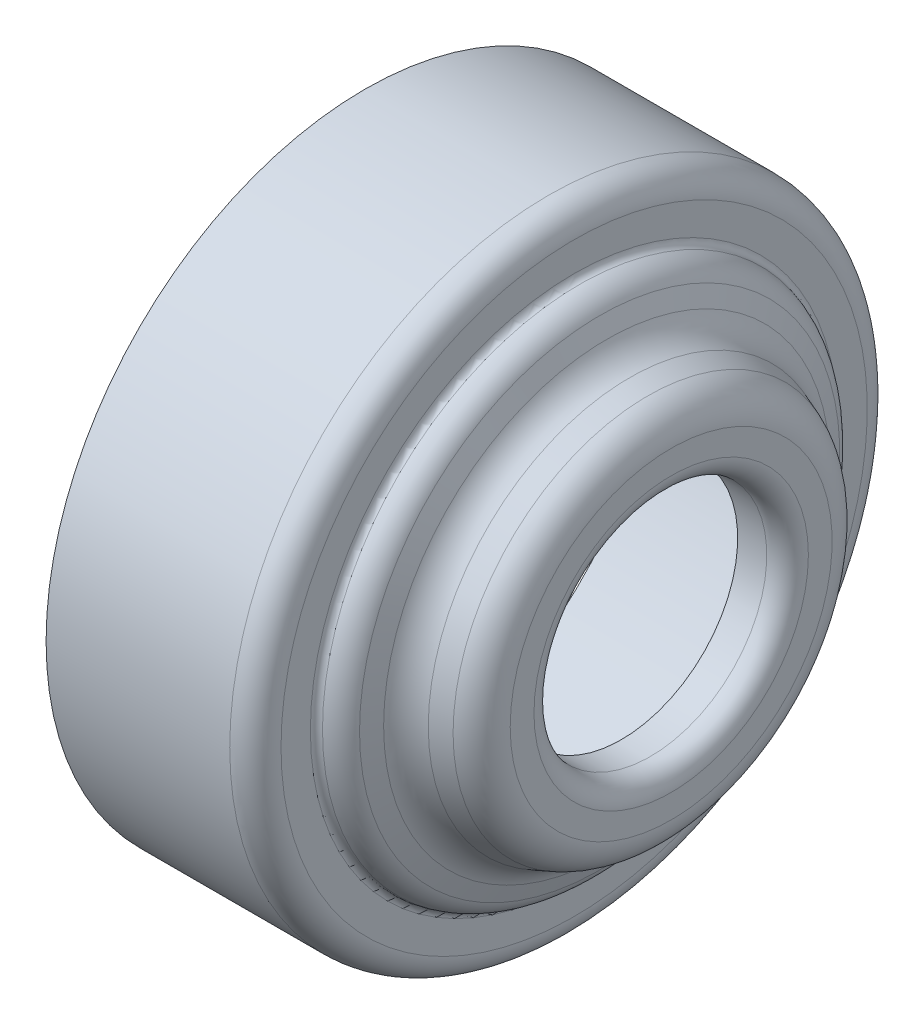
ISO-10303-21;
HEADER;
FILE_DESCRIPTION(('STEP AP214'),'2;1');
FILE_NAME('part.step','',(''),(''),'','','');
FILE_SCHEMA(('AUTOMOTIVE_DESIGN { 1 0 10303 214 1 1 1 1 }'));
ENDSEC;
DATA;
#1=APPLICATION_CONTEXT('core data for automotive mechanical design processes');
#2=APPLICATION_PROTOCOL_DEFINITION('international standard','automotive_design',2000,#1);
#3=PRODUCT_CONTEXT('',#1,'mechanical');
#4=PRODUCT('Part','Part','',(#3));
#5=PRODUCT_RELATED_PRODUCT_CATEGORY('part','',(#4));
#6=PRODUCT_DEFINITION_FORMATION('','',#4);
#7=PRODUCT_DEFINITION_CONTEXT('part definition',#1,'design');
#8=PRODUCT_DEFINITION('design','',#6,#7);
#9=PRODUCT_DEFINITION_SHAPE('','',#8);
#10=(LENGTH_UNIT() NAMED_UNIT(*) SI_UNIT(.MILLI.,.METRE.));
#11=(NAMED_UNIT(*) PLANE_ANGLE_UNIT() SI_UNIT($,.RADIAN.));
#12=(NAMED_UNIT(*) SI_UNIT($,.STERADIAN.) SOLID_ANGLE_UNIT());
#13=UNCERTAINTY_MEASURE_WITH_UNIT(LENGTH_MEASURE(1.E-05),#10,'distance_accuracy_value','');
#14=(GEOMETRIC_REPRESENTATION_CONTEXT(3) GLOBAL_UNCERTAINTY_ASSIGNED_CONTEXT((#13)) GLOBAL_UNIT_ASSIGNED_CONTEXT((#10,
#11,#12)) REPRESENTATION_CONTEXT('',''));
#15=CARTESIAN_POINT('',(0.,0.,0.));
#16=DIRECTION('',(0.,0.,1.));
#17=DIRECTION('',(1.,0.,0.));
#18=AXIS2_PLACEMENT_3D('',#15,#16,#17);
#19=CARTESIAN_POINT('',(-14.5,23.,0.));
#20=DIRECTION('',(1.,0.,0.));
#21=DIRECTION('',(0.,0.,-1.));
#22=AXIS2_PLACEMENT_3D('',#19,#20,#21);
#23=PLANE('',#22);
#24=CARTESIAN_POINT('',(-14.5,0.,0.));
#25=DIRECTION('',(-1.,0.,0.));
#26=DIRECTION('',(0.,0.,1.));
#27=AXIS2_PLACEMENT_3D('',#24,#25,#26);
#28=CIRCLE('',#27,22.);
#29=CARTESIAN_POINT('',(-14.5,0.,22.));
#30=VERTEX_POINT('',#29);
#31=EDGE_CURVE('E10',#30,#30,#28,.T.);
#32=ORIENTED_EDGE('',*,*,#31,.F.);
#33=EDGE_LOOP('',(#32));
#34=FACE_BOUND('',#33,.T.);
#35=CARTESIAN_POINT('',(-14.5,0.,0.));
#36=DIRECTION('',(-1.,0.,0.));
#37=DIRECTION('',(0.,0.,1.));
#38=AXIS2_PLACEMENT_3D('',#35,#36,#37);
#39=CIRCLE('',#38,23.);
#40=CARTESIAN_POINT('',(-14.5,0.,23.));
#41=VERTEX_POINT('',#40);
#42=EDGE_CURVE('E120',#41,#41,#39,.T.);
#43=ORIENTED_EDGE('',*,*,#42,.T.);
#44=EDGE_LOOP('',(#43));
#45=FACE_BOUND('',#44,.T.);
#46=ADVANCED_FACE('F35',(#34,#45),#23,.F.);
#47=CARTESIAN_POINT('',(-28.9724854245721,0.,0.));
#48=DIRECTION('',(-1.,0.,0.));
#49=DIRECTION('',(0.,0.,1.));
#50=AXIS2_PLACEMENT_3D('',#47,#48,#49);
#51=CYLINDRICAL_SURFACE('',#50,22.);
#52=CARTESIAN_POINT('',(-1.25000000000001,0.,0.));
#53=DIRECTION('',(-1.,0.,0.));
#54=DIRECTION('',(0.,0.,1.));
#55=AXIS2_PLACEMENT_3D('',#52,#53,#54);
#56=CIRCLE('',#55,22.);
#57=CARTESIAN_POINT('',(-1.25000000000001,0.,22.));
#58=VERTEX_POINT('',#57);
#59=EDGE_CURVE('E41',#58,#58,#56,.T.);
#60=ORIENTED_EDGE('',*,*,#59,.F.);
#61=EDGE_LOOP('',(#60));
#62=FACE_BOUND('',#61,.T.);
#63=ORIENTED_EDGE('',*,*,#31,.T.);
#64=EDGE_LOOP('',(#63));
#65=FACE_BOUND('',#64,.T.);
#66=ADVANCED_FACE('F271',(#62,#65),#51,.F.);
#67=CARTESIAN_POINT('',(-1.25,0.,0.));
#68=DIRECTION('',(-1.,0.,0.));
#69=DIRECTION('',(0.,0.,1.));
#70=AXIS2_PLACEMENT_3D('',#67,#68,#69);
#71=TOROIDAL_SURFACE('',#70,21.15,0.85);
#72=CARTESIAN_POINT('',(-0.399999999999998,0.,0.));
#73=DIRECTION('',(-1.,0.,0.));
#74=DIRECTION('',(0.,0.,1.));
#75=AXIS2_PLACEMENT_3D('',#72,#73,#74);
#76=CIRCLE('',#75,21.15);
#77=CARTESIAN_POINT('',(-0.399999999999998,0.,21.15));
#78=VERTEX_POINT('',#77);
#79=EDGE_CURVE('E45',#78,#78,#76,.T.);
#80=ORIENTED_EDGE('',*,*,#79,.F.);
#81=EDGE_LOOP('',(#80));
#82=FACE_BOUND('',#81,.T.);
#83=ORIENTED_EDGE('',*,*,#59,.T.);
#84=EDGE_LOOP('',(#83));
#85=FACE_BOUND('',#84,.T.);
#86=ADVANCED_FACE('F266',(#82,#85),#71,.F.);
#87=CARTESIAN_POINT('',(-0.399999999999999,21.15,0.));
#88=DIRECTION('',(1.,0.,0.));
#89=DIRECTION('',(0.,0.,-1.));
#90=AXIS2_PLACEMENT_3D('',#87,#88,#89);
#91=PLANE('',#90);
#92=CARTESIAN_POINT('',(-0.400000000000001,0.,0.));
#93=DIRECTION('',(-1.,0.,0.));
#94=DIRECTION('',(0.,0.,1.));
#95=AXIS2_PLACEMENT_3D('',#92,#93,#94);
#96=CIRCLE('',#95,18.1);
#97=CARTESIAN_POINT('',(-0.400000000000001,0.,18.1));
#98=VERTEX_POINT('',#97);
#99=EDGE_CURVE('E49',#98,#98,#96,.T.);
#100=ORIENTED_EDGE('',*,*,#99,.F.);
#101=EDGE_LOOP('',(#100));
#102=FACE_BOUND('',#101,.T.);
#103=ORIENTED_EDGE('',*,*,#79,.T.);
#104=EDGE_LOOP('',(#103));
#105=FACE_BOUND('',#104,.T.);
#106=ADVANCED_FACE('F260',(#102,#105),#91,.F.);
#107=CARTESIAN_POINT('',(0.100000000000001,0.,0.));
#108=DIRECTION('',(-1.,0.,0.));
#109=DIRECTION('',(0.,0.,1.));
#110=AXIS2_PLACEMENT_3D('',#107,#108,#109);
#111=TOROIDAL_SURFACE('',#110,18.1,0.5);
#112=CARTESIAN_POINT('',(0.100000000000003,0.,0.));
#113=DIRECTION('',(-1.,0.,0.));
#114=DIRECTION('',(0.,0.,1.));
#115=AXIS2_PLACEMENT_3D('',#112,#113,#114);
#116=CIRCLE('',#115,17.6);
#117=CARTESIAN_POINT('',(0.100000000000003,0.,17.6));
#118=VERTEX_POINT('',#117);
#119=EDGE_CURVE('E54',#118,#118,#116,.T.);
#120=ORIENTED_EDGE('',*,*,#119,.F.);
#121=EDGE_LOOP('',(#120));
#122=FACE_BOUND('',#121,.T.);
#123=ORIENTED_EDGE('',*,*,#99,.T.);
#124=EDGE_LOOP('',(#123));
#125=FACE_BOUND('',#124,.T.);
#126=ADVANCED_FACE('F254',(#122,#125),#111,.T.);
#127=CARTESIAN_POINT('',(-28.9724854245721,0.,0.));
#128=DIRECTION('',(-1.,0.,0.));
#129=DIRECTION('',(0.,0.,1.));
#130=AXIS2_PLACEMENT_3D('',#127,#128,#129);
#131=CYLINDRICAL_SURFACE('',#130,17.6);
#132=CARTESIAN_POINT('',(0.510905763029156,0.,0.));
#133=DIRECTION('',(-1.,0.,0.));
#134=DIRECTION('',(0.,0.,1.));
#135=AXIS2_PLACEMENT_3D('',#132,#133,#134);
#136=CIRCLE('',#135,17.6);
#137=CARTESIAN_POINT('',(0.510905763029156,0.,17.6));
#138=VERTEX_POINT('',#137);
#139=EDGE_CURVE('E57',#138,#138,#136,.T.);
#140=ORIENTED_EDGE('',*,*,#139,.F.);
#141=EDGE_LOOP('',(#140));
#142=FACE_BOUND('',#141,.T.);
#143=ORIENTED_EDGE('',*,*,#119,.T.);
#144=EDGE_LOOP('',(#143));
#145=FACE_BOUND('',#144,.T.);
#146=ADVANCED_FACE('F248',(#142,#145),#131,.F.);
#147=CARTESIAN_POINT('',(0.510905763029164,0.,0.));
#148=DIRECTION('',(-1.,0.,0.));
#149=DIRECTION('',(0.,0.,1.));
#150=AXIS2_PLACEMENT_3D('',#147,#148,#149);
#151=TOROIDAL_SURFACE('',#150,16.5,1.1);
#152=CARTESIAN_POINT('',(1.52196529604903,0.,0.));
#153=DIRECTION('',(-1.,0.,0.));
#154=DIRECTION('',(0.,0.,1.));
#155=AXIS2_PLACEMENT_3D('',#152,#153,#154);
#156=CIRCLE('',#155,16.9333112284371);
#157=CARTESIAN_POINT('',(1.52196529604903,0.,16.9333112284371));
#158=VERTEX_POINT('',#157);
#159=EDGE_CURVE('E60',#158,#158,#156,.T.);
#160=ORIENTED_EDGE('',*,*,#159,.F.);
#161=EDGE_LOOP('',(#160));
#162=FACE_BOUND('',#161,.T.);
#163=ORIENTED_EDGE('',*,*,#139,.T.);
#164=EDGE_LOOP('',(#163));
#165=FACE_BOUND('',#164,.T.);
#166=ADVANCED_FACE('F242',(#162,#165),#151,.F.);
#167=CARTESIAN_POINT('',(1.52196529604903,0.,0.));
#168=DIRECTION('',(-1.,0.,0.));
#169=DIRECTION('',(0.,0.,1.));
#170=AXIS2_PLACEMENT_3D('',#167,#168,#169);
#171=CONICAL_SURFACE('',#170,16.9333112284371,1.16590454050981);
#172=CARTESIAN_POINT('',(2.04362390714991,0.,0.));
#173=DIRECTION('',(-1.,0.,0.));
#174=DIRECTION('',(0.,0.,1.));
#175=AXIS2_PLACEMENT_3D('',#172,#173,#174);
#176=CIRCLE('',#175,15.716107802535);
#177=CARTESIAN_POINT('',(2.04362390714991,0.,15.716107802535));
#178=VERTEX_POINT('',#177);
#179=EDGE_CURVE('E63',#178,#178,#176,.T.);
#180=ORIENTED_EDGE('',*,*,#179,.F.);
#181=EDGE_LOOP('',(#180));
#182=FACE_BOUND('',#181,.T.);
#183=ORIENTED_EDGE('',*,*,#159,.T.);
#184=EDGE_LOOP('',(#183));
#185=FACE_BOUND('',#184,.T.);
#186=ADVANCED_FACE('F236',(#182,#185),#171,.F.);
#187=CARTESIAN_POINT('',(5.62828952422033,0.,0.));
#188=DIRECTION('',(-1.,0.,0.));
#189=DIRECTION('',(0.,0.,1.));
#190=AXIS2_PLACEMENT_3D('',#187,#188,#189);
#191=TOROIDAL_SURFACE('',#190,17.2523930669938,3.9);
#192=CARTESIAN_POINT('',(4.2589081020256,0.,0.));
#193=DIRECTION('',(-1.,0.,0.));
#194=DIRECTION('',(0.,0.,1.));
#195=AXIS2_PLACEMENT_3D('',#192,#193,#194);
#196=CIRCLE('',#195,13.6007092744745);
#197=CARTESIAN_POINT('',(4.2589081020256,0.,13.6007092744745));
#198=VERTEX_POINT('',#197);
#199=EDGE_CURVE('E66',#198,#198,#196,.T.);
#200=ORIENTED_EDGE('',*,*,#199,.F.);
#201=EDGE_LOOP('',(#200));
#202=FACE_BOUND('',#201,.T.);
#203=ORIENTED_EDGE('',*,*,#179,.T.);
#204=EDGE_LOOP('',(#203));
#205=FACE_BOUND('',#204,.T.);
#206=ADVANCED_FACE('F230',(#202,#205),#191,.T.);
#207=CARTESIAN_POINT('',(4.2589081020256,0.,0.));
#208=DIRECTION('',(-1.,0.,0.));
#209=DIRECTION('',(0.,0.,1.));
#210=AXIS2_PLACEMENT_3D('',#207,#208,#209);
#211=CONICAL_SURFACE('',#210,13.6007092744745,0.358770670270572);
#212=CARTESIAN_POINT('',(5.56179750654143,0.,0.));
#213=DIRECTION('',(-1.,0.,0.));
#214=DIRECTION('',(0.,0.,1.));
#215=AXIS2_PLACEMENT_3D('',#212,#213,#214);
#216=CIRCLE('',#215,13.1121257477811);
#217=CARTESIAN_POINT('',(5.56179750654143,0.,13.1121257477811));
#218=VERTEX_POINT('',#217);
#219=EDGE_CURVE('E69',#218,#218,#216,.T.);
#220=ORIENTED_EDGE('',*,*,#219,.F.);
#221=EDGE_LOOP('',(#220));
#222=FACE_BOUND('',#221,.T.);
#223=ORIENTED_EDGE('',*,*,#199,.T.);
#224=EDGE_LOOP('',(#223));
#225=FACE_BOUND('',#224,.T.);
#226=ADVANCED_FACE('F224',(#222,#225),#211,.F.);
#227=CARTESIAN_POINT('',(5.,0.,0.));
#228=DIRECTION('',(-1.,0.,0.));
#229=DIRECTION('',(0.,0.,1.));
#230=AXIS2_PLACEMENT_3D('',#227,#228,#229);
#231=TOROIDAL_SURFACE('',#230,11.6139990636706,1.6);
#232=CARTESIAN_POINT('',(6.6,0.,0.));
#233=DIRECTION('',(-1.,0.,0.));
#234=DIRECTION('',(0.,0.,1.));
#235=AXIS2_PLACEMENT_3D('',#232,#233,#234);
#236=CIRCLE('',#235,11.6139990636706);
#237=CARTESIAN_POINT('',(6.6,0.,11.6139990636706));
#238=VERTEX_POINT('',#237);
#239=EDGE_CURVE('E72',#238,#238,#236,.T.);
#240=ORIENTED_EDGE('',*,*,#239,.F.);
#241=EDGE_LOOP('',(#240));
#242=FACE_BOUND('',#241,.T.);
#243=ORIENTED_EDGE('',*,*,#219,.T.);
#244=EDGE_LOOP('',(#243));
#245=FACE_BOUND('',#244,.T.);
#246=ADVANCED_FACE('F218',(#242,#245),#231,.F.);
#247=CARTESIAN_POINT('',(6.6,11.6139990636706,0.));
#248=DIRECTION('',(1.,0.,0.));
#249=DIRECTION('',(0.,0.,-1.));
#250=AXIS2_PLACEMENT_3D('',#247,#248,#249);
#251=PLANE('',#250);
#252=CARTESIAN_POINT('',(6.59999999999999,0.,0.));
#253=DIRECTION('',(-1.,0.,0.));
#254=DIRECTION('',(0.,0.,1.));
#255=AXIS2_PLACEMENT_3D('',#252,#253,#254);
#256=CIRCLE('',#255,9.89999999999999);
#257=CARTESIAN_POINT('',(6.59999999999999,0.,9.89999999999999));
#258=VERTEX_POINT('',#257);
#259=EDGE_CURVE('E75',#258,#258,#256,.T.);
#260=ORIENTED_EDGE('',*,*,#259,.F.);
#261=EDGE_LOOP('',(#260));
#262=FACE_BOUND('',#261,.T.);
#263=ORIENTED_EDGE('',*,*,#239,.T.);
#264=EDGE_LOOP('',(#263));
#265=FACE_BOUND('',#264,.T.);
#266=ADVANCED_FACE('F212',(#262,#265),#251,.F.);
#267=CARTESIAN_POINT('',(6.1,0.,0.));
#268=DIRECTION('',(-1.,0.,0.));
#269=DIRECTION('',(0.,0.,1.));
#270=AXIS2_PLACEMENT_3D('',#267,#268,#269);
#271=TOROIDAL_SURFACE('',#270,9.89999999999998,0.499999999999999);
#272=CARTESIAN_POINT('',(6.09999999999999,0.,0.));
#273=DIRECTION('',(-1.,0.,0.));
#274=DIRECTION('',(0.,0.,1.));
#275=AXIS2_PLACEMENT_3D('',#272,#273,#274);
#276=CIRCLE('',#275,9.39999999999999);
#277=CARTESIAN_POINT('',(6.09999999999999,0.,9.39999999999999));
#278=VERTEX_POINT('',#277);
#279=EDGE_CURVE('E78',#278,#278,#276,.T.);
#280=ORIENTED_EDGE('',*,*,#279,.F.);
#281=EDGE_LOOP('',(#280));
#282=FACE_BOUND('',#281,.T.);
#283=ORIENTED_EDGE('',*,*,#259,.T.);
#284=EDGE_LOOP('',(#283));
#285=FACE_BOUND('',#284,.T.);
#286=ADVANCED_FACE('F206',(#282,#285),#271,.F.);
#287=CARTESIAN_POINT('',(-28.9724854245721,0.,0.));
#288=DIRECTION('',(-1.,0.,0.));
#289=DIRECTION('',(0.,0.,1.));
#290=AXIS2_PLACEMENT_3D('',#287,#288,#289);
#291=CYLINDRICAL_SURFACE('',#290,9.39999999999999);
#292=CARTESIAN_POINT('',(4.,0.,0.));
#293=DIRECTION('',(-1.,0.,0.));
#294=DIRECTION('',(0.,0.,1.));
#295=AXIS2_PLACEMENT_3D('',#292,#293,#294);
#296=CIRCLE('',#295,9.4);
#297=CARTESIAN_POINT('',(4.,0.,9.4));
#298=VERTEX_POINT('',#297);
#299=EDGE_CURVE('E81',#298,#298,#296,.T.);
#300=ORIENTED_EDGE('',*,*,#299,.F.);
#301=EDGE_LOOP('',(#300));
#302=FACE_BOUND('',#301,.T.);
#303=ORIENTED_EDGE('',*,*,#279,.T.);
#304=EDGE_LOOP('',(#303));
#305=FACE_BOUND('',#304,.T.);
#306=ADVANCED_FACE('F200',(#302,#305),#291,.T.);
#307=CARTESIAN_POINT('',(4.,9.4,0.));
#308=DIRECTION('',(1.,0.,0.));
#309=DIRECTION('',(0.,0.,-1.));
#310=AXIS2_PLACEMENT_3D('',#307,#308,#309);
#311=PLANE('',#310);
#312=CARTESIAN_POINT('',(4.,0.,0.));
#313=DIRECTION('',(-1.,0.,0.));
#314=DIRECTION('',(0.,0.,1.));
#315=AXIS2_PLACEMENT_3D('',#312,#313,#314);
#316=CIRCLE('',#315,8.4);
#317=CARTESIAN_POINT('',(4.,0.,8.4));
#318=VERTEX_POINT('',#317);
#319=EDGE_CURVE('E84',#318,#318,#316,.T.);
#320=ORIENTED_EDGE('',*,*,#319,.F.);
#321=EDGE_LOOP('',(#320));
#322=FACE_BOUND('',#321,.T.);
#323=ORIENTED_EDGE('',*,*,#299,.T.);
#324=EDGE_LOOP('',(#323));
#325=FACE_BOUND('',#324,.T.);
#326=ADVANCED_FACE('F194',(#322,#325),#311,.F.);
#327=CARTESIAN_POINT('',(-28.9724854245721,0.,0.));
#328=DIRECTION('',(-1.,0.,0.));
#329=DIRECTION('',(0.,0.,1.));
#330=AXIS2_PLACEMENT_3D('',#327,#328,#329);
#331=CYLINDRICAL_SURFACE('',#330,8.39999999999999);
#332=CARTESIAN_POINT('',(6.09999999999997,0.,0.));
#333=DIRECTION('',(-1.,0.,0.));
#334=DIRECTION('',(0.,0.,1.));
#335=AXIS2_PLACEMENT_3D('',#332,#333,#334);
#336=CIRCLE('',#335,8.39999999999999);
#337=CARTESIAN_POINT('',(6.09999999999997,0.,8.39999999999999));
#338=VERTEX_POINT('',#337);
#339=EDGE_CURVE('E87',#338,#338,#336,.T.);
#340=ORIENTED_EDGE('',*,*,#339,.F.);
#341=EDGE_LOOP('',(#340));
#342=FACE_BOUND('',#341,.T.);
#343=ORIENTED_EDGE('',*,*,#319,.T.);
#344=EDGE_LOOP('',(#343));
#345=FACE_BOUND('',#344,.T.);
#346=ADVANCED_FACE('F188',(#342,#345),#331,.F.);
#347=CARTESIAN_POINT('',(6.1,0.,0.));
#348=DIRECTION('',(-1.,0.,0.));
#349=DIRECTION('',(0.,0.,1.));
#350=AXIS2_PLACEMENT_3D('',#347,#348,#349);
#351=TOROIDAL_SURFACE('',#350,9.89999999999998,1.5);
#352=CARTESIAN_POINT('',(7.6,0.,0.));
#353=DIRECTION('',(-1.,0.,0.));
#354=DIRECTION('',(0.,0.,1.));
#355=AXIS2_PLACEMENT_3D('',#352,#353,#354);
#356=CIRCLE('',#355,9.89999999999999);
#357=CARTESIAN_POINT('',(7.6,0.,9.89999999999999));
#358=VERTEX_POINT('',#357);
#359=EDGE_CURVE('E90',#358,#358,#356,.T.);
#360=ORIENTED_EDGE('',*,*,#359,.F.);
#361=EDGE_LOOP('',(#360));
#362=FACE_BOUND('',#361,.T.);
#363=ORIENTED_EDGE('',*,*,#339,.T.);
#364=EDGE_LOOP('',(#363));
#365=FACE_BOUND('',#364,.T.);
#366=ADVANCED_FACE('F182',(#362,#365),#351,.T.);
#367=CARTESIAN_POINT('',(7.6,11.6139990636706,0.));
#368=DIRECTION('',(-1.,0.,0.));
#369=DIRECTION('',(0.,0.,1.));
#370=AXIS2_PLACEMENT_3D('',#367,#368,#369);
#371=PLANE('',#370);
#372=CARTESIAN_POINT('',(7.6,0.,0.));
#373=DIRECTION('',(-1.,0.,0.));
#374=DIRECTION('',(0.,0.,1.));
#375=AXIS2_PLACEMENT_3D('',#372,#373,#374);
#376=CIRCLE('',#375,11.6139990636706);
#377=CARTESIAN_POINT('',(7.6,0.,11.6139990636706));
#378=VERTEX_POINT('',#377);
#379=EDGE_CURVE('E93',#378,#378,#376,.T.);
#380=ORIENTED_EDGE('',*,*,#379,.F.);
#381=EDGE_LOOP('',(#380));
#382=FACE_BOUND('',#381,.T.);
#383=ORIENTED_EDGE('',*,*,#359,.T.);
#384=EDGE_LOOP('',(#383));
#385=FACE_BOUND('',#384,.T.);
#386=ADVANCED_FACE('F176',(#382,#385),#371,.F.);
#387=CARTESIAN_POINT('',(5.,0.,0.));
#388=DIRECTION('',(-1.,0.,0.));
#389=DIRECTION('',(0.,0.,1.));
#390=AXIS2_PLACEMENT_3D('',#387,#388,#389);
#391=TOROIDAL_SURFACE('',#390,11.6139990636706,2.6);
#392=CARTESIAN_POINT('',(5.91292094812982,0.,0.));
#393=DIRECTION('',(-1.,0.,0.));
#394=DIRECTION('',(0.,0.,1.));
#395=AXIS2_PLACEMENT_3D('',#392,#393,#394);
#396=CIRCLE('',#395,14.0484549253501);
#397=CARTESIAN_POINT('',(5.91292094812982,0.,14.0484549253501));
#398=VERTEX_POINT('',#397);
#399=EDGE_CURVE('E96',#398,#398,#396,.T.);
#400=ORIENTED_EDGE('',*,*,#399,.F.);
#401=EDGE_LOOP('',(#400));
#402=FACE_BOUND('',#401,.T.);
#403=ORIENTED_EDGE('',*,*,#379,.T.);
#404=EDGE_LOOP('',(#403));
#405=FACE_BOUND('',#404,.T.);
#406=ADVANCED_FACE('F170',(#402,#405),#391,.T.);
#407=CARTESIAN_POINT('',(5.91292094812982,0.,0.));
#408=DIRECTION('',(-1.,0.,0.));
#409=DIRECTION('',(0.,0.,1.));
#410=AXIS2_PLACEMENT_3D('',#407,#408,#409);
#411=CONICAL_SURFACE('',#410,14.0484549253501,0.358770670270573);
#412=CARTESIAN_POINT('',(4.61003154361399,0.,0.));
#413=DIRECTION('',(-1.,0.,0.));
#414=DIRECTION('',(0.,0.,1.));
#415=AXIS2_PLACEMENT_3D('',#412,#413,#414);
#416=CIRCLE('',#415,14.5370384520436);
#417=CARTESIAN_POINT('',(4.61003154361399,0.,14.5370384520436));
#418=VERTEX_POINT('',#417);
#419=EDGE_CURVE('E99',#418,#418,#416,.T.);
#420=ORIENTED_EDGE('',*,*,#419,.F.);
#421=EDGE_LOOP('',(#420));
#422=FACE_BOUND('',#421,.T.);
#423=ORIENTED_EDGE('',*,*,#399,.T.);
#424=EDGE_LOOP('',(#423));
#425=FACE_BOUND('',#424,.T.);
#426=ADVANCED_FACE('F164',(#422,#425),#411,.T.);
#427=CARTESIAN_POINT('',(5.62828952422033,0.,0.));
#428=DIRECTION('',(-1.,0.,0.));
#429=DIRECTION('',(0.,0.,1.));
#430=AXIS2_PLACEMENT_3D('',#427,#428,#429);
#431=TOROIDAL_SURFACE('',#430,17.2523930669938,2.9);
#432=CARTESIAN_POINT('',(2.96276893716797,0.,0.));
#433=DIRECTION('',(-1.,0.,0.));
#434=DIRECTION('',(0.,0.,1.));
#435=AXIS2_PLACEMENT_3D('',#432,#433,#434);
#436=CIRCLE('',#435,16.1100271011142);
#437=CARTESIAN_POINT('',(2.96276893716797,0.,16.1100271011142));
#438=VERTEX_POINT('',#437);
#439=EDGE_CURVE('E102',#438,#438,#436,.T.);
#440=ORIENTED_EDGE('',*,*,#439,.F.);
#441=EDGE_LOOP('',(#440));
#442=FACE_BOUND('',#441,.T.);
#443=ORIENTED_EDGE('',*,*,#419,.T.);
#444=EDGE_LOOP('',(#443));
#445=FACE_BOUND('',#444,.T.);
#446=ADVANCED_FACE('F158',(#442,#445),#431,.F.);
#447=CARTESIAN_POINT('',(2.96276893716797,0.,0.));
#448=DIRECTION('',(-1.,0.,0.));
#449=DIRECTION('',(0.,0.,1.));
#450=AXIS2_PLACEMENT_3D('',#447,#448,#449);
#451=CONICAL_SURFACE('',#450,16.1100271011142,1.16590454050981);
#452=CARTESIAN_POINT('',(2.44111032606709,0.,0.));
#453=DIRECTION('',(-1.,0.,0.));
#454=DIRECTION('',(0.,0.,1.));
#455=AXIS2_PLACEMENT_3D('',#452,#453,#454);
#456=CIRCLE('',#455,17.3272305270162);
#457=CARTESIAN_POINT('',(2.44111032606709,0.,17.3272305270162));
#458=VERTEX_POINT('',#457);
#459=EDGE_CURVE('E105',#458,#458,#456,.T.);
#460=ORIENTED_EDGE('',*,*,#459,.F.);
#461=EDGE_LOOP('',(#460));
#462=FACE_BOUND('',#461,.T.);
#463=ORIENTED_EDGE('',*,*,#439,.T.);
#464=EDGE_LOOP('',(#463));
#465=FACE_BOUND('',#464,.T.);
#466=ADVANCED_FACE('F152',(#462,#465),#451,.T.);
#467=CARTESIAN_POINT('',(0.510905763029164,0.,0.));
#468=DIRECTION('',(-1.,0.,0.));
#469=DIRECTION('',(0.,0.,1.));
#470=AXIS2_PLACEMENT_3D('',#467,#468,#469);
#471=TOROIDAL_SURFACE('',#470,16.5,2.1);
#472=CARTESIAN_POINT('',(0.986712646736377,0.,0.));
#473=DIRECTION('',(-1.,0.,0.));
#474=DIRECTION('',(0.,0.,1.));
#475=AXIS2_PLACEMENT_3D('',#472,#473,#474);
#476=CIRCLE('',#475,18.545386958357);
#477=CARTESIAN_POINT('',(0.986712646736377,0.,18.545386958357));
#478=VERTEX_POINT('',#477);
#479=EDGE_CURVE('E108',#478,#478,#476,.T.);
#480=ORIENTED_EDGE('',*,*,#479,.F.);
#481=EDGE_LOOP('',(#480));
#482=FACE_BOUND('',#481,.T.);
#483=ORIENTED_EDGE('',*,*,#459,.T.);
#484=EDGE_LOOP('',(#483));
#485=FACE_BOUND('',#484,.T.);
#486=ADVANCED_FACE('F146',(#482,#485),#471,.T.);
#487=CARTESIAN_POINT('',(1.1,0.,0.));
#488=DIRECTION('',(-1.,0.,0.));
#489=DIRECTION('',(0.,0.,1.));
#490=AXIS2_PLACEMENT_3D('',#487,#488,#489);
#491=TOROIDAL_SURFACE('',#490,19.0323838532039,0.5);
#492=CARTESIAN_POINT('',(0.6,0.,0.));
#493=DIRECTION('',(-1.,0.,0.));
#494=DIRECTION('',(0.,0.,1.));
#495=AXIS2_PLACEMENT_3D('',#492,#493,#494);
#496=CIRCLE('',#495,19.0323838532039);
#497=CARTESIAN_POINT('',(0.6,0.,19.0323838532039));
#498=VERTEX_POINT('',#497);
#499=EDGE_CURVE('E111',#498,#498,#496,.T.);
#500=ORIENTED_EDGE('',*,*,#499,.F.);
#501=EDGE_LOOP('',(#500));
#502=FACE_BOUND('',#501,.T.);
#503=ORIENTED_EDGE('',*,*,#479,.T.);
#504=EDGE_LOOP('',(#503));
#505=FACE_BOUND('',#504,.T.);
#506=ADVANCED_FACE('F140',(#502,#505),#491,.F.);
#507=CARTESIAN_POINT('',(0.600000000000001,21.15,0.));
#508=DIRECTION('',(-1.,0.,0.));
#509=DIRECTION('',(0.,0.,1.));
#510=AXIS2_PLACEMENT_3D('',#507,#508,#509);
#511=PLANE('',#510);
#512=CARTESIAN_POINT('',(0.6,0.,0.));
#513=DIRECTION('',(-1.,0.,0.));
#514=DIRECTION('',(0.,0.,1.));
#515=AXIS2_PLACEMENT_3D('',#512,#513,#514);
#516=CIRCLE('',#515,21.15);
#517=CARTESIAN_POINT('',(0.6,0.,21.15));
#518=VERTEX_POINT('',#517);
#519=EDGE_CURVE('E114',#518,#518,#516,.T.);
#520=ORIENTED_EDGE('',*,*,#519,.F.);
#521=EDGE_LOOP('',(#520));
#522=FACE_BOUND('',#521,.T.);
#523=ORIENTED_EDGE('',*,*,#499,.T.);
#524=EDGE_LOOP('',(#523));
#525=FACE_BOUND('',#524,.T.);
#526=ADVANCED_FACE('F134',(#522,#525),#511,.F.);
#527=CARTESIAN_POINT('',(-1.25,0.,0.));
#528=DIRECTION('',(-1.,0.,0.));
#529=DIRECTION('',(0.,0.,1.));
#530=AXIS2_PLACEMENT_3D('',#527,#528,#529);
#531=TOROIDAL_SURFACE('',#530,21.15,1.85);
#532=CARTESIAN_POINT('',(-1.25000000000001,0.,0.));
#533=DIRECTION('',(-1.,0.,0.));
#534=DIRECTION('',(0.,0.,1.));
#535=AXIS2_PLACEMENT_3D('',#532,#533,#534);
#536=CIRCLE('',#535,23.);
#537=CARTESIAN_POINT('',(-1.25000000000001,0.,23.));
#538=VERTEX_POINT('',#537);
#539=EDGE_CURVE('E117',#538,#538,#536,.T.);
#540=ORIENTED_EDGE('',*,*,#539,.F.);
#541=EDGE_LOOP('',(#540));
#542=FACE_BOUND('',#541,.T.);
#543=ORIENTED_EDGE('',*,*,#519,.T.);
#544=EDGE_LOOP('',(#543));
#545=FACE_BOUND('',#544,.T.);
#546=ADVANCED_FACE('F128',(#542,#545),#531,.T.);
#547=CARTESIAN_POINT('',(-28.9724854245721,0.,0.));
#548=DIRECTION('',(-1.,0.,0.));
#549=DIRECTION('',(0.,0.,1.));
#550=AXIS2_PLACEMENT_3D('',#547,#548,#549);
#551=CYLINDRICAL_SURFACE('',#550,23.);
#552=ORIENTED_EDGE('',*,*,#42,.F.);
#553=EDGE_LOOP('',(#552));
#554=FACE_BOUND('',#553,.T.);
#555=ORIENTED_EDGE('',*,*,#539,.T.);
#556=EDGE_LOOP('',(#555));
#557=FACE_BOUND('',#556,.T.);
#558=ADVANCED_FACE('F125',(#554,#557),#551,.T.);
#559=CLOSED_SHELL('',(#46,#66,#86,#106,#126,#146,#166,#186,#206,#226,#246,#266,#286,#306,#326,
#346,#366,#386,#406,#426,#446,#466,#486,#506,#526,#546,#558));
#560=MANIFOLD_SOLID_BREP('B2',#559);
#561=ADVANCED_BREP_SHAPE_REPRESENTATION('',(#18,#560),#14);
#562=SHAPE_DEFINITION_REPRESENTATION(#9,#561);
ENDSEC;
END-ISO-10303-21;
